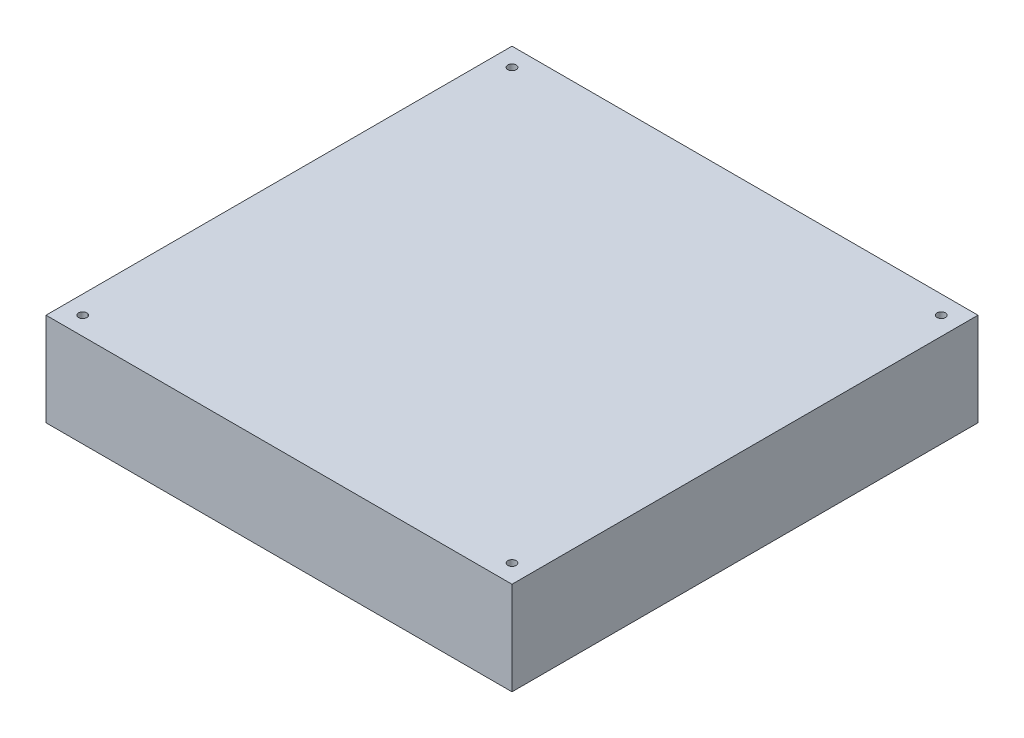
ISO-10303-21;
HEADER;
FILE_DESCRIPTION(('STEP AP214'),'2;1');
FILE_NAME('part.step','',(''),(''),'','','');
FILE_SCHEMA(('AUTOMOTIVE_DESIGN { 1 0 10303 214 1 1 1 1 }'));
ENDSEC;
DATA;
#1=APPLICATION_CONTEXT('core data for automotive mechanical design processes');
#2=APPLICATION_PROTOCOL_DEFINITION('international standard','automotive_design',2000,#1);
#3=PRODUCT_CONTEXT('',#1,'mechanical');
#4=PRODUCT('Part','Part','',(#3));
#5=PRODUCT_RELATED_PRODUCT_CATEGORY('part','',(#4));
#6=PRODUCT_DEFINITION_FORMATION('','',#4);
#7=PRODUCT_DEFINITION_CONTEXT('part definition',#1,'design');
#8=PRODUCT_DEFINITION('design','',#6,#7);
#9=PRODUCT_DEFINITION_SHAPE('','',#8);
#10=(LENGTH_UNIT() NAMED_UNIT(*) SI_UNIT(.MILLI.,.METRE.));
#11=(NAMED_UNIT(*) PLANE_ANGLE_UNIT() SI_UNIT($,.RADIAN.));
#12=(NAMED_UNIT(*) SI_UNIT($,.STERADIAN.) SOLID_ANGLE_UNIT());
#13=UNCERTAINTY_MEASURE_WITH_UNIT(LENGTH_MEASURE(1.E-05),#10,'distance_accuracy_value','');
#14=(GEOMETRIC_REPRESENTATION_CONTEXT(3) GLOBAL_UNCERTAINTY_ASSIGNED_CONTEXT((#13)) GLOBAL_UNIT_ASSIGNED_CONTEXT((#10,
#11,#12)) REPRESENTATION_CONTEXT('',''));
#15=CARTESIAN_POINT('',(0.,0.,0.));
#16=DIRECTION('',(0.,0.,1.));
#17=DIRECTION('',(1.,0.,0.));
#18=AXIS2_PLACEMENT_3D('',#15,#16,#17);
#19=CARTESIAN_POINT('',(63.5,25.4,-63.5));
#20=DIRECTION('',(-1.,0.,0.));
#21=DIRECTION('',(0.,0.,1.));
#22=AXIS2_PLACEMENT_3D('',#19,#20,#21);
#23=PLANE('',#22);
#24=DIRECTION('',(0.,0.,-1.));
#25=VECTOR('',#24,1.);
#26=CARTESIAN_POINT('',(63.5,0.,-63.5));
#27=LINE('',#26,#25);
#28=CARTESIAN_POINT('',(63.5,0.,63.5));
#29=VERTEX_POINT('',#28);
#30=CARTESIAN_POINT('',(63.5,0.,-63.5));
#31=VERTEX_POINT('',#30);
#32=EDGE_CURVE('E96',#29,#31,#27,.T.);
#33=ORIENTED_EDGE('',*,*,#32,.T.);
#34=DIRECTION('',(0.,-1.,0.));
#35=VECTOR('',#34,1.);
#36=CARTESIAN_POINT('',(63.5,25.4,-63.5));
#37=LINE('',#36,#35);
#38=CARTESIAN_POINT('',(63.5,25.4,-63.5));
#39=VERTEX_POINT('',#38);
#40=EDGE_CURVE('E11',#39,#31,#37,.T.);
#41=ORIENTED_EDGE('',*,*,#40,.F.);
#42=DIRECTION('',(0.,0.,-1.));
#43=VECTOR('',#42,1.);
#44=CARTESIAN_POINT('',(63.5,25.4,-63.5));
#45=LINE('',#44,#43);
#46=CARTESIAN_POINT('',(63.5,25.4,63.5));
#47=VERTEX_POINT('',#46);
#48=EDGE_CURVE('E84',#47,#39,#45,.T.);
#49=ORIENTED_EDGE('',*,*,#48,.F.);
#50=DIRECTION('',(0.,-1.,0.));
#51=VECTOR('',#50,1.);
#52=CARTESIAN_POINT('',(63.5,25.4,63.5));
#53=LINE('',#52,#51);
#54=EDGE_CURVE('E92',#47,#29,#53,.T.);
#55=ORIENTED_EDGE('',*,*,#54,.T.);
#56=EDGE_LOOP('',(#33,#41,#49,#55));
#57=FACE_BOUND('',#56,.T.);
#58=ADVANCED_FACE('F33',(#57),#23,.F.);
#59=CARTESIAN_POINT('',(-63.5,25.4,-63.5));
#60=DIRECTION('',(0.,0.,1.));
#61=DIRECTION('',(1.,0.,0.));
#62=AXIS2_PLACEMENT_3D('',#59,#60,#61);
#63=PLANE('',#62);
#64=DIRECTION('',(-1.,0.,0.));
#65=VECTOR('',#64,1.);
#66=CARTESIAN_POINT('',(-63.5,0.,-63.5));
#67=LINE('',#66,#65);
#68=CARTESIAN_POINT('',(-63.5,0.,-63.5));
#69=VERTEX_POINT('',#68);
#70=EDGE_CURVE('E88',#31,#69,#67,.T.);
#71=ORIENTED_EDGE('',*,*,#70,.T.);
#72=DIRECTION('',(0.,-1.,0.));
#73=VECTOR('',#72,1.);
#74=CARTESIAN_POINT('',(-63.5,25.4,-63.5));
#75=LINE('',#74,#73);
#76=CARTESIAN_POINT('',(-63.5,25.4,-63.5));
#77=VERTEX_POINT('',#76);
#78=EDGE_CURVE('E41',#77,#69,#75,.T.);
#79=ORIENTED_EDGE('',*,*,#78,.F.);
#80=DIRECTION('',(-1.,0.,0.));
#81=VECTOR('',#80,1.);
#82=CARTESIAN_POINT('',(-63.5,25.4,-63.5));
#83=LINE('',#82,#81);
#84=EDGE_CURVE('E79',#39,#77,#83,.T.);
#85=ORIENTED_EDGE('',*,*,#84,.F.);
#86=ORIENTED_EDGE('',*,*,#40,.T.);
#87=EDGE_LOOP('',(#71,#79,#85,#86));
#88=FACE_BOUND('',#87,.T.);
#89=ADVANCED_FACE('F87',(#88),#63,.F.);
#90=CARTESIAN_POINT('',(-63.5,25.4,-63.5));
#91=DIRECTION('',(1.,0.,0.));
#92=DIRECTION('',(0.,0.,-1.));
#93=AXIS2_PLACEMENT_3D('',#90,#91,#92);
#94=PLANE('',#93);
#95=DIRECTION('',(0.,0.,1.));
#96=VECTOR('',#95,1.);
#97=CARTESIAN_POINT('',(-63.5,0.,-63.5));
#98=LINE('',#97,#96);
#99=CARTESIAN_POINT('',(-63.5,0.,63.5));
#100=VERTEX_POINT('',#99);
#101=EDGE_CURVE('E66',#69,#100,#98,.T.);
#102=ORIENTED_EDGE('',*,*,#101,.T.);
#103=DIRECTION('',(0.,-1.,0.));
#104=VECTOR('',#103,1.);
#105=CARTESIAN_POINT('',(-63.5,25.4,63.5));
#106=LINE('',#105,#104);
#107=CARTESIAN_POINT('',(-63.5,25.4,63.5));
#108=VERTEX_POINT('',#107);
#109=EDGE_CURVE('E89',#108,#100,#106,.T.);
#110=ORIENTED_EDGE('',*,*,#109,.F.);
#111=DIRECTION('',(0.,0.,1.));
#112=VECTOR('',#111,1.);
#113=CARTESIAN_POINT('',(-63.5,25.4,-63.5));
#114=LINE('',#113,#112);
#115=EDGE_CURVE('E82',#77,#108,#114,.T.);
#116=ORIENTED_EDGE('',*,*,#115,.F.);
#117=ORIENTED_EDGE('',*,*,#78,.T.);
#118=EDGE_LOOP('',(#102,#110,#116,#117));
#119=FACE_BOUND('',#118,.T.);
#120=ADVANCED_FACE('F90',(#119),#94,.F.);
#121=CARTESIAN_POINT('',(-63.5,25.4,63.5));
#122=DIRECTION('',(0.,0.,-1.));
#123=DIRECTION('',(-1.,0.,0.));
#124=AXIS2_PLACEMENT_3D('',#121,#122,#123);
#125=PLANE('',#124);
#126=DIRECTION('',(1.,0.,0.));
#127=VECTOR('',#126,1.);
#128=CARTESIAN_POINT('',(-63.5,0.,63.5));
#129=LINE('',#128,#127);
#130=EDGE_CURVE('E72',#100,#29,#129,.T.);
#131=ORIENTED_EDGE('',*,*,#130,.T.);
#132=ORIENTED_EDGE('',*,*,#54,.F.);
#133=DIRECTION('',(1.,0.,0.));
#134=VECTOR('',#133,1.);
#135=CARTESIAN_POINT('',(-63.5,25.4,63.5));
#136=LINE('',#135,#134);
#137=EDGE_CURVE('E49',#108,#47,#136,.T.);
#138=ORIENTED_EDGE('',*,*,#137,.F.);
#139=ORIENTED_EDGE('',*,*,#109,.T.);
#140=EDGE_LOOP('',(#131,#132,#138,#139));
#141=FACE_BOUND('',#140,.T.);
#142=ADVANCED_FACE('F104',(#141),#125,.F.);
#143=CARTESIAN_POINT('',(0.,25.4,0.));
#144=DIRECTION('',(0.,1.,0.));
#145=DIRECTION('',(0.,0.,1.));
#146=AXIS2_PLACEMENT_3D('',#143,#144,#145);
#147=PLANE('',#146);
#148=CARTESIAN_POINT('',(-58.5,25.4,-58.5));
#149=DIRECTION('',(0.,1.,0.));
#150=DIRECTION('',(0.,0.,-1.));
#151=AXIS2_PLACEMENT_3D('',#148,#149,#150);
#152=CIRCLE('',#151,1.1303);
#153=CARTESIAN_POINT('',(-58.5,25.4,-59.6303));
#154=VERTEX_POINT('',#153);
#155=EDGE_CURVE('E130',#154,#154,#152,.T.);
#156=ORIENTED_EDGE('',*,*,#155,.F.);
#157=EDGE_LOOP('',(#156));
#158=FACE_BOUND('',#157,.T.);
#159=CARTESIAN_POINT('',(58.5,25.4,-58.5));
#160=DIRECTION('',(0.,1.,0.));
#161=DIRECTION('',(0.,0.,1.));
#162=AXIS2_PLACEMENT_3D('',#159,#160,#161);
#163=CIRCLE('',#162,1.1303);
#164=CARTESIAN_POINT('',(58.5,25.4,-57.3697));
#165=VERTEX_POINT('',#164);
#166=EDGE_CURVE('E124',#165,#165,#163,.T.);
#167=ORIENTED_EDGE('',*,*,#166,.F.);
#168=EDGE_LOOP('',(#167));
#169=FACE_BOUND('',#168,.T.);
#170=CARTESIAN_POINT('',(58.5,25.4,58.5));
#171=DIRECTION('',(0.,1.,0.));
#172=DIRECTION('',(0.,0.,-1.));
#173=AXIS2_PLACEMENT_3D('',#170,#171,#172);
#174=CIRCLE('',#173,1.1303);
#175=CARTESIAN_POINT('',(58.5,25.4,57.3697));
#176=VERTEX_POINT('',#175);
#177=EDGE_CURVE('E118',#176,#176,#174,.T.);
#178=ORIENTED_EDGE('',*,*,#177,.F.);
#179=EDGE_LOOP('',(#178));
#180=FACE_BOUND('',#179,.T.);
#181=CARTESIAN_POINT('',(-58.5,25.4,58.5));
#182=DIRECTION('',(0.,1.,0.));
#183=DIRECTION('',(0.,0.,1.));
#184=AXIS2_PLACEMENT_3D('',#181,#182,#183);
#185=CIRCLE('',#184,1.1303);
#186=CARTESIAN_POINT('',(-58.5,25.4,59.6303));
#187=VERTEX_POINT('',#186);
#188=EDGE_CURVE('E112',#187,#187,#185,.T.);
#189=ORIENTED_EDGE('',*,*,#188,.F.);
#190=EDGE_LOOP('',(#189));
#191=FACE_BOUND('',#190,.T.);
#192=ORIENTED_EDGE('',*,*,#48,.T.);
#193=ORIENTED_EDGE('',*,*,#84,.T.);
#194=ORIENTED_EDGE('',*,*,#115,.T.);
#195=ORIENTED_EDGE('',*,*,#137,.T.);
#196=EDGE_LOOP('',(#192,#193,#194,#195));
#197=FACE_BOUND('',#196,.T.);
#198=ADVANCED_FACE('F80',(#158,#169,#180,#191,#197),#147,.T.);
#199=CARTESIAN_POINT('',(0.,0.,0.));
#200=DIRECTION('',(0.,1.,0.));
#201=DIRECTION('',(0.,0.,1.));
#202=AXIS2_PLACEMENT_3D('',#199,#200,#201);
#203=PLANE('',#202);
#204=CARTESIAN_POINT('',(-58.5,0.,-58.5));
#205=DIRECTION('',(0.,1.,0.));
#206=DIRECTION('',(0.,0.,1.));
#207=AXIS2_PLACEMENT_3D('',#204,#205,#206);
#208=CIRCLE('',#207,1.1303);
#209=CARTESIAN_POINT('',(-58.5,0.,-57.3697));
#210=VERTEX_POINT('',#209);
#211=EDGE_CURVE('E127',#210,#210,#208,.F.);
#212=ORIENTED_EDGE('',*,*,#211,.F.);
#213=EDGE_LOOP('',(#212));
#214=FACE_BOUND('',#213,.T.);
#215=CARTESIAN_POINT('',(58.5,0.,-58.5));
#216=DIRECTION('',(0.,1.,0.));
#217=DIRECTION('',(0.,0.,1.));
#218=AXIS2_PLACEMENT_3D('',#215,#216,#217);
#219=CIRCLE('',#218,1.1303);
#220=CARTESIAN_POINT('',(58.5,0.,-57.3697));
#221=VERTEX_POINT('',#220);
#222=EDGE_CURVE('E121',#221,#221,#219,.F.);
#223=ORIENTED_EDGE('',*,*,#222,.F.);
#224=EDGE_LOOP('',(#223));
#225=FACE_BOUND('',#224,.T.);
#226=CARTESIAN_POINT('',(58.5,0.,58.5));
#227=DIRECTION('',(0.,1.,0.));
#228=DIRECTION('',(0.,0.,1.));
#229=AXIS2_PLACEMENT_3D('',#226,#227,#228);
#230=CIRCLE('',#229,1.1303);
#231=CARTESIAN_POINT('',(58.5,0.,59.6303));
#232=VERTEX_POINT('',#231);
#233=EDGE_CURVE('E115',#232,#232,#230,.F.);
#234=ORIENTED_EDGE('',*,*,#233,.F.);
#235=EDGE_LOOP('',(#234));
#236=FACE_BOUND('',#235,.T.);
#237=CARTESIAN_POINT('',(-58.5,0.,58.5));
#238=DIRECTION('',(0.,1.,0.));
#239=DIRECTION('',(0.,0.,1.));
#240=AXIS2_PLACEMENT_3D('',#237,#238,#239);
#241=CIRCLE('',#240,1.1303);
#242=CARTESIAN_POINT('',(-58.5,0.,59.6303));
#243=VERTEX_POINT('',#242);
#244=EDGE_CURVE('E99',#243,#243,#241,.F.);
#245=ORIENTED_EDGE('',*,*,#244,.F.);
#246=EDGE_LOOP('',(#245));
#247=FACE_BOUND('',#246,.T.);
#248=ORIENTED_EDGE('',*,*,#32,.F.);
#249=ORIENTED_EDGE('',*,*,#130,.F.);
#250=ORIENTED_EDGE('',*,*,#101,.F.);
#251=ORIENTED_EDGE('',*,*,#70,.F.);
#252=EDGE_LOOP('',(#248,#249,#250,#251));
#253=FACE_BOUND('',#252,.T.);
#254=ADVANCED_FACE('F107',(#214,#225,#236,#247,#253),#203,.F.);
#255=CARTESIAN_POINT('',(-58.5,-3.19697117910062,58.5));
#256=DIRECTION('',(0.,1.,0.));
#257=DIRECTION('',(0.,0.,1.));
#258=AXIS2_PLACEMENT_3D('',#255,#256,#257);
#259=CYLINDRICAL_SURFACE('',#258,1.1303);
#260=ORIENTED_EDGE('',*,*,#244,.T.);
#261=EDGE_LOOP('',(#260));
#262=FACE_BOUND('',#261,.T.);
#263=ORIENTED_EDGE('',*,*,#188,.T.);
#264=EDGE_LOOP('',(#263));
#265=FACE_BOUND('',#264,.T.);
#266=ADVANCED_FACE('F145',(#262,#265),#259,.F.);
#267=CARTESIAN_POINT('',(58.5,-3.19697117910062,58.5));
#268=DIRECTION('',(0.,1.,0.));
#269=DIRECTION('',(0.,0.,1.));
#270=AXIS2_PLACEMENT_3D('',#267,#268,#269);
#271=CYLINDRICAL_SURFACE('',#270,1.1303);
#272=ORIENTED_EDGE('',*,*,#233,.T.);
#273=EDGE_LOOP('',(#272));
#274=FACE_BOUND('',#273,.T.);
#275=ORIENTED_EDGE('',*,*,#177,.T.);
#276=EDGE_LOOP('',(#275));
#277=FACE_BOUND('',#276,.T.);
#278=ADVANCED_FACE('F147',(#274,#277),#271,.F.);
#279=CARTESIAN_POINT('',(58.5,-3.19697117910062,-58.5));
#280=DIRECTION('',(0.,1.,0.));
#281=DIRECTION('',(0.,0.,1.));
#282=AXIS2_PLACEMENT_3D('',#279,#280,#281);
#283=CYLINDRICAL_SURFACE('',#282,1.1303);
#284=ORIENTED_EDGE('',*,*,#222,.T.);
#285=EDGE_LOOP('',(#284));
#286=FACE_BOUND('',#285,.T.);
#287=ORIENTED_EDGE('',*,*,#166,.T.);
#288=EDGE_LOOP('',(#287));
#289=FACE_BOUND('',#288,.T.);
#290=ADVANCED_FACE('F154',(#286,#289),#283,.F.);
#291=CARTESIAN_POINT('',(-58.5,-3.19697117910062,-58.5));
#292=DIRECTION('',(0.,1.,0.));
#293=DIRECTION('',(0.,0.,1.));
#294=AXIS2_PLACEMENT_3D('',#291,#292,#293);
#295=CYLINDRICAL_SURFACE('',#294,1.1303);
#296=ORIENTED_EDGE('',*,*,#211,.T.);
#297=EDGE_LOOP('',(#296));
#298=FACE_BOUND('',#297,.T.);
#299=ORIENTED_EDGE('',*,*,#155,.T.);
#300=EDGE_LOOP('',(#299));
#301=FACE_BOUND('',#300,.T.);
#302=ADVANCED_FACE('F134',(#298,#301),#295,.F.);
#303=CLOSED_SHELL('',(#58,#89,#120,#142,#198,#254,#266,#278,#290,#302));
#304=MANIFOLD_SOLID_BREP('B2',#303);
#305=ADVANCED_BREP_SHAPE_REPRESENTATION('',(#18,#304),#14);
#306=SHAPE_DEFINITION_REPRESENTATION(#9,#305);
ENDSEC;
END-ISO-10303-21;
